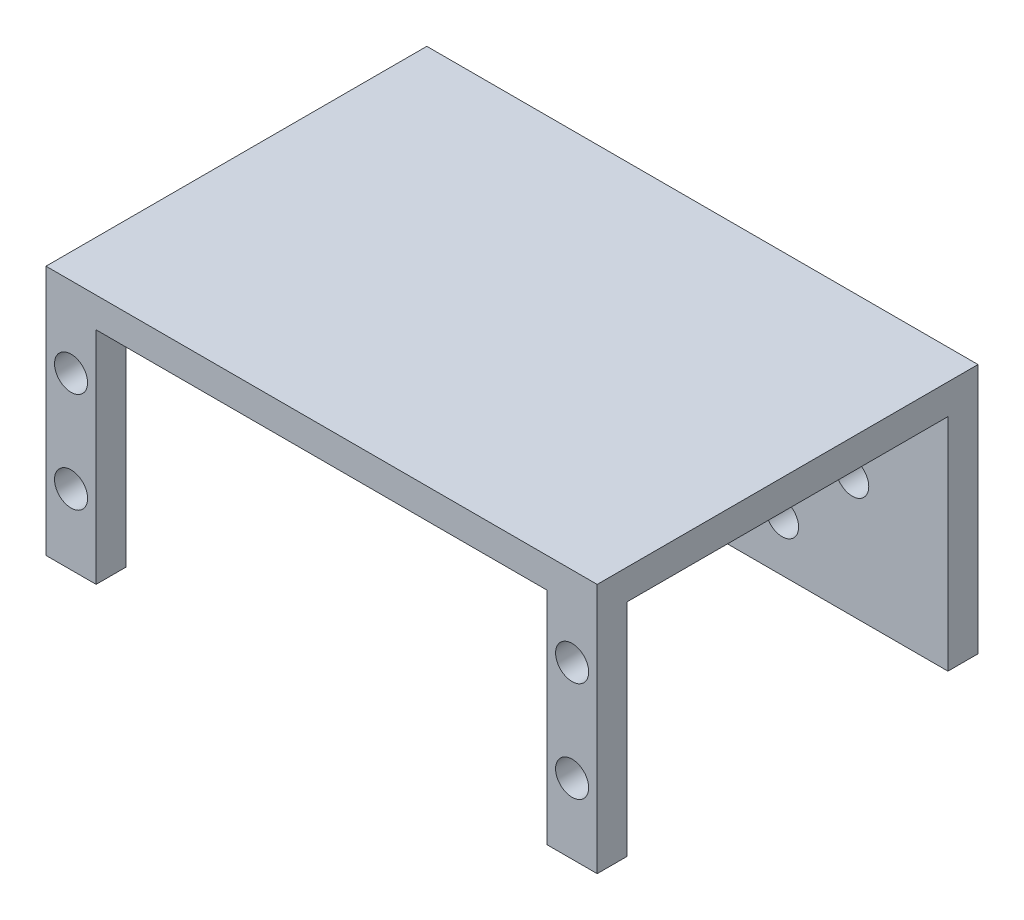
ISO-10303-21;
HEADER;
FILE_DESCRIPTION(('STEP AP214'),'2;1');
FILE_NAME('part.step','',(''),(''),'','','');
FILE_SCHEMA(('AUTOMOTIVE_DESIGN { 1 0 10303 214 1 1 1 1 }'));
ENDSEC;
DATA;
#1=APPLICATION_CONTEXT('core data for automotive mechanical design processes');
#2=APPLICATION_PROTOCOL_DEFINITION('international standard','automotive_design',2000,#1);
#3=PRODUCT_CONTEXT('',#1,'mechanical');
#4=PRODUCT('Part','Part','',(#3));
#5=PRODUCT_RELATED_PRODUCT_CATEGORY('part','',(#4));
#6=PRODUCT_DEFINITION_FORMATION('','',#4);
#7=PRODUCT_DEFINITION_CONTEXT('part definition',#1,'design');
#8=PRODUCT_DEFINITION('design','',#6,#7);
#9=PRODUCT_DEFINITION_SHAPE('','',#8);
#10=(LENGTH_UNIT() NAMED_UNIT(*) SI_UNIT(.MILLI.,.METRE.));
#11=(NAMED_UNIT(*) PLANE_ANGLE_UNIT() SI_UNIT($,.RADIAN.));
#12=(NAMED_UNIT(*) SI_UNIT($,.STERADIAN.) SOLID_ANGLE_UNIT());
#13=UNCERTAINTY_MEASURE_WITH_UNIT(LENGTH_MEASURE(1.E-05),#10,'distance_accuracy_value','');
#14=(GEOMETRIC_REPRESENTATION_CONTEXT(3) GLOBAL_UNCERTAINTY_ASSIGNED_CONTEXT((#13)) GLOBAL_UNIT_ASSIGNED_CONTEXT((#10,
#11,#12)) REPRESENTATION_CONTEXT('',''));
#15=CARTESIAN_POINT('',(0.,0.,0.));
#16=DIRECTION('',(0.,0.,1.));
#17=DIRECTION('',(1.,0.,0.));
#18=AXIS2_PLACEMENT_3D('',#15,#16,#17);
#19=CARTESIAN_POINT('',(-27.5,9.5,38.));
#20=DIRECTION('',(0.,1.,0.));
#21=DIRECTION('',(-1.,0.,0.));
#22=AXIS2_PLACEMENT_3D('',#19,#20,#21);
#23=PLANE('',#22);
#24=DIRECTION('',(0.,0.,-1.));
#25=VECTOR('',#24,1.);
#26=CARTESIAN_POINT('',(22.5,9.5,38.));
#27=LINE('',#26,#25);
#28=CARTESIAN_POINT('',(22.5,9.5,38.));
#29=VERTEX_POINT('',#28);
#30=CARTESIAN_POINT('',(22.5,9.5,35.));
#31=VERTEX_POINT('',#30);
#32=EDGE_CURVE('E164',#29,#31,#27,.T.);
#33=ORIENTED_EDGE('',*,*,#32,.F.);
#34=DIRECTION('',(1.,0.,0.));
#35=VECTOR('',#34,1.);
#36=CARTESIAN_POINT('',(-27.5,9.5,38.));
#37=LINE('',#36,#35);
#38=CARTESIAN_POINT('',(-22.5,9.5,38.));
#39=VERTEX_POINT('',#38);
#40=EDGE_CURVE('E145',#39,#29,#37,.T.);
#41=ORIENTED_EDGE('',*,*,#40,.F.);
#42=DIRECTION('',(0.,0.,1.));
#43=VECTOR('',#42,1.);
#44=CARTESIAN_POINT('',(-22.5,9.5,38.));
#45=LINE('',#44,#43);
#46=CARTESIAN_POINT('',(-22.5,9.5,35.));
#47=VERTEX_POINT('',#46);
#48=EDGE_CURVE('E191',#47,#39,#45,.T.);
#49=ORIENTED_EDGE('',*,*,#48,.F.);
#50=DIRECTION('',(1.,0.,0.));
#51=VECTOR('',#50,1.);
#52=CARTESIAN_POINT('',(-27.5,9.5,35.));
#53=LINE('',#52,#51);
#54=CARTESIAN_POINT('',(-27.5,9.5,35.));
#55=VERTEX_POINT('',#54);
#56=EDGE_CURVE('E185',#55,#47,#53,.T.);
#57=ORIENTED_EDGE('',*,*,#56,.F.);
#58=DIRECTION('',(0.,0.,-1.));
#59=VECTOR('',#58,1.);
#60=CARTESIAN_POINT('',(-27.5,9.5,38.));
#61=LINE('',#60,#59);
#62=CARTESIAN_POINT('',(-27.5,9.5,3.));
#63=VERTEX_POINT('',#62);
#64=EDGE_CURVE('E65',#55,#63,#61,.T.);
#65=ORIENTED_EDGE('',*,*,#64,.T.);
#66=DIRECTION('',(1.,0.,0.));
#67=VECTOR('',#66,1.);
#68=CARTESIAN_POINT('',(-27.5,9.5,3.));
#69=LINE('',#68,#67);
#70=CARTESIAN_POINT('',(27.5,9.5,3.));
#71=VERTEX_POINT('',#70);
#72=EDGE_CURVE('E214',#63,#71,#69,.T.);
#73=ORIENTED_EDGE('',*,*,#72,.T.);
#74=DIRECTION('',(0.,0.,-1.));
#75=VECTOR('',#74,1.);
#76=CARTESIAN_POINT('',(27.5,9.5,38.));
#77=LINE('',#76,#75);
#78=CARTESIAN_POINT('',(27.5,9.5,35.));
#79=VERTEX_POINT('',#78);
#80=EDGE_CURVE('E222',#79,#71,#77,.T.);
#81=ORIENTED_EDGE('',*,*,#80,.F.);
#82=DIRECTION('',(1.,0.,0.));
#83=VECTOR('',#82,1.);
#84=CARTESIAN_POINT('',(27.5,9.5,35.));
#85=LINE('',#84,#83);
#86=EDGE_CURVE('E161',#31,#79,#85,.T.);
#87=ORIENTED_EDGE('',*,*,#86,.F.);
#88=EDGE_LOOP('',(#33,#41,#49,#57,#65,#73,#81,#87));
#89=FACE_BOUND('',#88,.T.);
#90=ADVANCED_FACE('F39',(#89),#23,.F.);
#91=CARTESIAN_POINT('',(0.,0.,3.));
#92=DIRECTION('',(0.,0.,-1.));
#93=DIRECTION('',(-1.,0.,0.));
#94=AXIS2_PLACEMENT_3D('',#91,#92,#93);
#95=PLANE('',#94);
#96=CARTESIAN_POINT('',(17.95,-0.499999999999997,3.));
#97=DIRECTION('',(0.,0.,1.));
#98=DIRECTION('',(1.,0.,0.));
#99=AXIS2_PLACEMENT_3D('',#96,#97,#98);
#100=CIRCLE('',#99,1.65);
#101=CARTESIAN_POINT('',(19.6,-0.499999999999997,3.));
#102=VERTEX_POINT('',#101);
#103=EDGE_CURVE('E267',#102,#102,#100,.T.);
#104=ORIENTED_EDGE('',*,*,#103,.F.);
#105=EDGE_LOOP('',(#104));
#106=FACE_BOUND('',#105,.T.);
#107=CARTESIAN_POINT('',(10.95,6.5,3.));
#108=DIRECTION('',(0.,0.,1.));
#109=DIRECTION('',(1.,0.,0.));
#110=AXIS2_PLACEMENT_3D('',#107,#108,#109);
#111=CIRCLE('',#110,1.65);
#112=CARTESIAN_POINT('',(12.6,6.5,3.));
#113=VERTEX_POINT('',#112);
#114=EDGE_CURVE('E583',#113,#113,#111,.T.);
#115=ORIENTED_EDGE('',*,*,#114,.F.);
#116=EDGE_LOOP('',(#115));
#117=FACE_BOUND('',#116,.T.);
#118=CARTESIAN_POINT('',(3.94999999999999,-0.499999999999997,3.));
#119=DIRECTION('',(0.,0.,1.));
#120=DIRECTION('',(1.,0.,0.));
#121=AXIS2_PLACEMENT_3D('',#118,#119,#120);
#122=CIRCLE('',#121,1.65);
#123=CARTESIAN_POINT('',(5.59999999999999,-0.499999999999997,3.));
#124=VERTEX_POINT('',#123);
#125=EDGE_CURVE('E587',#124,#124,#122,.T.);
#126=ORIENTED_EDGE('',*,*,#125,.F.);
#127=EDGE_LOOP('',(#126));
#128=FACE_BOUND('',#127,.T.);
#129=CARTESIAN_POINT('',(10.95,-7.5,3.));
#130=DIRECTION('',(0.,0.,1.));
#131=DIRECTION('',(1.,0.,0.));
#132=AXIS2_PLACEMENT_3D('',#129,#130,#131);
#133=CIRCLE('',#132,1.65);
#134=CARTESIAN_POINT('',(12.6,-7.5,3.));
#135=VERTEX_POINT('',#134);
#136=EDGE_CURVE('E592',#135,#135,#133,.T.);
#137=ORIENTED_EDGE('',*,*,#136,.F.);
#138=EDGE_LOOP('',(#137));
#139=FACE_BOUND('',#138,.T.);
#140=ORIENTED_EDGE('',*,*,#72,.F.);
#141=DIRECTION('',(0.,-1.,0.));
#142=VECTOR('',#141,1.);
#143=CARTESIAN_POINT('',(-27.5,-12.5,3.));
#144=LINE('',#143,#142);
#145=CARTESIAN_POINT('',(-27.5,-12.5,3.));
#146=VERTEX_POINT('',#145);
#147=EDGE_CURVE('E234',#63,#146,#144,.T.);
#148=ORIENTED_EDGE('',*,*,#147,.T.);
#149=DIRECTION('',(1.,0.,0.));
#150=VECTOR('',#149,1.);
#151=CARTESIAN_POINT('',(-27.5,-12.5,3.));
#152=LINE('',#151,#150);
#153=CARTESIAN_POINT('',(27.5,-12.5,3.));
#154=VERTEX_POINT('',#153);
#155=EDGE_CURVE('E238',#146,#154,#152,.T.);
#156=ORIENTED_EDGE('',*,*,#155,.T.);
#157=DIRECTION('',(0.,1.,0.));
#158=VECTOR('',#157,1.);
#159=CARTESIAN_POINT('',(27.5,-12.5,3.));
#160=LINE('',#159,#158);
#161=EDGE_CURVE('E230',#154,#71,#160,.T.);
#162=ORIENTED_EDGE('',*,*,#161,.T.);
#163=EDGE_LOOP('',(#140,#148,#156,#162));
#164=FACE_BOUND('',#163,.T.);
#165=ADVANCED_FACE('F334',(#106,#117,#128,#139,#164),#95,.F.);
#166=CARTESIAN_POINT('',(27.5,-12.5,3.));
#167=DIRECTION('',(-1.,0.,0.));
#168=DIRECTION('',(0.,0.,1.));
#169=AXIS2_PLACEMENT_3D('',#166,#167,#168);
#170=PLANE('',#169);
#171=DIRECTION('',(0.,1.,0.));
#172=VECTOR('',#171,1.);
#173=CARTESIAN_POINT('',(27.5,-12.5,0.));
#174=LINE('',#173,#172);
#175=CARTESIAN_POINT('',(27.5,-12.5,0.));
#176=VERTEX_POINT('',#175);
#177=CARTESIAN_POINT('',(27.5,12.5,0.));
#178=VERTEX_POINT('',#177);
#179=EDGE_CURVE('E229',#176,#178,#174,.T.);
#180=ORIENTED_EDGE('',*,*,#179,.T.);
#181=DIRECTION('',(0.,0.,-1.));
#182=VECTOR('',#181,1.);
#183=CARTESIAN_POINT('',(27.5,12.5,3.));
#184=LINE('',#183,#182);
#185=CARTESIAN_POINT('',(27.5,12.5,38.));
#186=VERTEX_POINT('',#185);
#187=EDGE_CURVE('E11',#186,#178,#184,.T.);
#188=ORIENTED_EDGE('',*,*,#187,.F.);
#189=DIRECTION('',(0.,1.,0.));
#190=VECTOR('',#189,1.);
#191=CARTESIAN_POINT('',(27.5,12.5,38.));
#192=LINE('',#191,#190);
#193=CARTESIAN_POINT('',(27.5,-12.5,38.));
#194=VERTEX_POINT('',#193);
#195=EDGE_CURVE('E135',#194,#186,#192,.T.);
#196=ORIENTED_EDGE('',*,*,#195,.F.);
#197=DIRECTION('',(0.,0.,1.));
#198=VECTOR('',#197,1.);
#199=CARTESIAN_POINT('',(27.5,-12.5,38.));
#200=LINE('',#199,#198);
#201=CARTESIAN_POINT('',(27.5,-12.5,35.));
#202=VERTEX_POINT('',#201);
#203=EDGE_CURVE('E140',#202,#194,#200,.T.);
#204=ORIENTED_EDGE('',*,*,#203,.F.);
#205=DIRECTION('',(0.,1.,0.));
#206=VECTOR('',#205,1.);
#207=CARTESIAN_POINT('',(27.5,-12.5,35.));
#208=LINE('',#207,#206);
#209=EDGE_CURVE('E174',#202,#79,#208,.T.);
#210=ORIENTED_EDGE('',*,*,#209,.T.);
#211=ORIENTED_EDGE('',*,*,#80,.T.);
#212=ORIENTED_EDGE('',*,*,#161,.F.);
#213=DIRECTION('',(0.,0.,-1.));
#214=VECTOR('',#213,1.);
#215=CARTESIAN_POINT('',(27.5,-12.5,3.));
#216=LINE('',#215,#214);
#217=EDGE_CURVE('E241',#154,#176,#216,.T.);
#218=ORIENTED_EDGE('',*,*,#217,.T.);
#219=EDGE_LOOP('',(#180,#188,#196,#204,#210,#211,#212,#218));
#220=FACE_BOUND('',#219,.T.);
#221=ADVANCED_FACE('F41',(#220),#170,.F.);
#222=CARTESIAN_POINT('',(-27.5,12.5,3.));
#223=DIRECTION('',(0.,-1.,0.));
#224=DIRECTION('',(0.,0.,-1.));
#225=AXIS2_PLACEMENT_3D('',#222,#223,#224);
#226=PLANE('',#225);
#227=DIRECTION('',(-1.,0.,0.));
#228=VECTOR('',#227,1.);
#229=CARTESIAN_POINT('',(-27.5,12.5,0.));
#230=LINE('',#229,#228);
#231=CARTESIAN_POINT('',(-27.5,12.5,0.));
#232=VERTEX_POINT('',#231);
#233=EDGE_CURVE('E244',#178,#232,#230,.T.);
#234=ORIENTED_EDGE('',*,*,#233,.T.);
#235=DIRECTION('',(0.,0.,-1.));
#236=VECTOR('',#235,1.);
#237=CARTESIAN_POINT('',(-27.5,12.5,3.));
#238=LINE('',#237,#236);
#239=CARTESIAN_POINT('',(-27.5,12.5,38.));
#240=VERTEX_POINT('',#239);
#241=EDGE_CURVE('E49',#240,#232,#238,.T.);
#242=ORIENTED_EDGE('',*,*,#241,.F.);
#243=DIRECTION('',(-1.,0.,0.));
#244=VECTOR('',#243,1.);
#245=CARTESIAN_POINT('',(-27.5,12.5,38.));
#246=LINE('',#245,#244);
#247=EDGE_CURVE('E144',#186,#240,#246,.T.);
#248=ORIENTED_EDGE('',*,*,#247,.F.);
#249=ORIENTED_EDGE('',*,*,#187,.T.);
#250=EDGE_LOOP('',(#234,#242,#248,#249));
#251=FACE_BOUND('',#250,.T.);
#252=ADVANCED_FACE('F349',(#251),#226,.F.);
#253=CARTESIAN_POINT('',(-27.5,-12.5,3.));
#254=DIRECTION('',(1.,0.,0.));
#255=DIRECTION('',(0.,0.,-1.));
#256=AXIS2_PLACEMENT_3D('',#253,#254,#255);
#257=PLANE('',#256);
#258=DIRECTION('',(0.,-1.,0.));
#259=VECTOR('',#258,1.);
#260=CARTESIAN_POINT('',(-27.5,-12.5,0.));
#261=LINE('',#260,#259);
#262=CARTESIAN_POINT('',(-27.5,-12.5,0.));
#263=VERTEX_POINT('',#262);
#264=EDGE_CURVE('E247',#232,#263,#261,.T.);
#265=ORIENTED_EDGE('',*,*,#264,.T.);
#266=DIRECTION('',(0.,0.,-1.));
#267=VECTOR('',#266,1.);
#268=CARTESIAN_POINT('',(-27.5,-12.5,3.));
#269=LINE('',#268,#267);
#270=EDGE_CURVE('E255',#146,#263,#269,.T.);
#271=ORIENTED_EDGE('',*,*,#270,.F.);
#272=ORIENTED_EDGE('',*,*,#147,.F.);
#273=ORIENTED_EDGE('',*,*,#64,.F.);
#274=DIRECTION('',(0.,1.,0.));
#275=VECTOR('',#274,1.);
#276=CARTESIAN_POINT('',(-27.5,-12.5,35.));
#277=LINE('',#276,#275);
#278=CARTESIAN_POINT('',(-27.5,-12.5,35.));
#279=VERTEX_POINT('',#278);
#280=EDGE_CURVE('E211',#279,#55,#277,.T.);
#281=ORIENTED_EDGE('',*,*,#280,.F.);
#282=DIRECTION('',(0.,0.,-1.));
#283=VECTOR('',#282,1.);
#284=CARTESIAN_POINT('',(-27.5,-12.5,38.));
#285=LINE('',#284,#283);
#286=CARTESIAN_POINT('',(-27.5,-12.5,38.));
#287=VERTEX_POINT('',#286);
#288=EDGE_CURVE('E186',#287,#279,#285,.T.);
#289=ORIENTED_EDGE('',*,*,#288,.F.);
#290=DIRECTION('',(0.,-1.,0.));
#291=VECTOR('',#290,1.);
#292=CARTESIAN_POINT('',(-27.5,12.5,38.));
#293=LINE('',#292,#291);
#294=EDGE_CURVE('E215',#240,#287,#293,.T.);
#295=ORIENTED_EDGE('',*,*,#294,.F.);
#296=ORIENTED_EDGE('',*,*,#241,.T.);
#297=EDGE_LOOP('',(#265,#271,#272,#273,#281,#289,#295,#296));
#298=FACE_BOUND('',#297,.T.);
#299=ADVANCED_FACE('F337',(#298),#257,.F.);
#300=CARTESIAN_POINT('',(-27.5,-12.5,3.));
#301=DIRECTION('',(0.,1.,0.));
#302=DIRECTION('',(0.,0.,1.));
#303=AXIS2_PLACEMENT_3D('',#300,#301,#302);
#304=PLANE('',#303);
#305=DIRECTION('',(1.,0.,0.));
#306=VECTOR('',#305,1.);
#307=CARTESIAN_POINT('',(-27.5,-12.5,0.));
#308=LINE('',#307,#306);
#309=EDGE_CURVE('E235',#263,#176,#308,.T.);
#310=ORIENTED_EDGE('',*,*,#309,.T.);
#311=ORIENTED_EDGE('',*,*,#217,.F.);
#312=ORIENTED_EDGE('',*,*,#155,.F.);
#313=ORIENTED_EDGE('',*,*,#270,.T.);
#314=EDGE_LOOP('',(#310,#311,#312,#313));
#315=FACE_BOUND('',#314,.T.);
#316=ADVANCED_FACE('F344',(#315),#304,.F.);
#317=CARTESIAN_POINT('',(0.,0.,0.));
#318=DIRECTION('',(0.,0.,-1.));
#319=DIRECTION('',(-1.,0.,0.));
#320=AXIS2_PLACEMENT_3D('',#317,#318,#319);
#321=PLANE('',#320);
#322=CARTESIAN_POINT('',(17.95,-0.499999999999997,0.));
#323=DIRECTION('',(0.,0.,-1.));
#324=DIRECTION('',(-1.,0.,0.));
#325=AXIS2_PLACEMENT_3D('',#322,#323,#324);
#326=CIRCLE('',#325,1.65);
#327=CARTESIAN_POINT('',(16.3,-0.499999999999997,0.));
#328=VERTEX_POINT('',#327);
#329=EDGE_CURVE('E43',#328,#328,#326,.T.);
#330=ORIENTED_EDGE('',*,*,#329,.F.);
#331=EDGE_LOOP('',(#330));
#332=FACE_BOUND('',#331,.T.);
#333=CARTESIAN_POINT('',(10.95,6.5,0.));
#334=DIRECTION('',(0.,0.,-1.));
#335=DIRECTION('',(-1.,0.,0.));
#336=AXIS2_PLACEMENT_3D('',#333,#334,#335);
#337=CIRCLE('',#336,1.65);
#338=CARTESIAN_POINT('',(9.29999999999999,6.5,0.));
#339=VERTEX_POINT('',#338);
#340=EDGE_CURVE('E270',#339,#339,#337,.T.);
#341=ORIENTED_EDGE('',*,*,#340,.F.);
#342=EDGE_LOOP('',(#341));
#343=FACE_BOUND('',#342,.T.);
#344=CARTESIAN_POINT('',(3.94999999999999,-0.499999999999997,0.));
#345=DIRECTION('',(0.,0.,-1.));
#346=DIRECTION('',(-1.,0.,0.));
#347=AXIS2_PLACEMENT_3D('',#344,#345,#346);
#348=CIRCLE('',#347,1.65);
#349=CARTESIAN_POINT('',(2.29999999999999,-0.499999999999997,0.));
#350=VERTEX_POINT('',#349);
#351=EDGE_CURVE('E266',#350,#350,#348,.T.);
#352=ORIENTED_EDGE('',*,*,#351,.F.);
#353=EDGE_LOOP('',(#352));
#354=FACE_BOUND('',#353,.T.);
#355=CARTESIAN_POINT('',(10.95,-7.5,0.));
#356=DIRECTION('',(0.,0.,-1.));
#357=DIRECTION('',(-1.,0.,0.));
#358=AXIS2_PLACEMENT_3D('',#355,#356,#357);
#359=CIRCLE('',#358,1.65);
#360=CARTESIAN_POINT('',(9.29999999999999,-7.5,0.));
#361=VERTEX_POINT('',#360);
#362=EDGE_CURVE('E262',#361,#361,#359,.T.);
#363=ORIENTED_EDGE('',*,*,#362,.F.);
#364=EDGE_LOOP('',(#363));
#365=FACE_BOUND('',#364,.T.);
#366=ORIENTED_EDGE('',*,*,#179,.F.);
#367=ORIENTED_EDGE('',*,*,#309,.F.);
#368=ORIENTED_EDGE('',*,*,#264,.F.);
#369=ORIENTED_EDGE('',*,*,#233,.F.);
#370=EDGE_LOOP('',(#366,#367,#368,#369));
#371=FACE_BOUND('',#370,.T.);
#372=ADVANCED_FACE('F347',(#332,#343,#354,#365,#371),#321,.T.);
#373=CARTESIAN_POINT('',(0.,0.,38.));
#374=DIRECTION('',(0.,0.,1.));
#375=DIRECTION('',(1.,0.,0.));
#376=AXIS2_PLACEMENT_3D('',#373,#374,#375);
#377=PLANE('',#376);
#378=CARTESIAN_POINT('',(25.,-5.5,38.));
#379=DIRECTION('',(0.,0.,1.));
#380=DIRECTION('',(-1.,0.,0.));
#381=AXIS2_PLACEMENT_3D('',#378,#379,#380);
#382=CIRCLE('',#381,1.65);
#383=CARTESIAN_POINT('',(23.35,-5.5,38.));
#384=VERTEX_POINT('',#383);
#385=EDGE_CURVE('E277',#384,#384,#382,.T.);
#386=ORIENTED_EDGE('',*,*,#385,.F.);
#387=EDGE_LOOP('',(#386));
#388=FACE_BOUND('',#387,.T.);
#389=CARTESIAN_POINT('',(25.,4.5,38.));
#390=DIRECTION('',(0.,0.,1.));
#391=DIRECTION('',(-1.,0.,0.));
#392=AXIS2_PLACEMENT_3D('',#389,#390,#391);
#393=CIRCLE('',#392,1.65);
#394=CARTESIAN_POINT('',(23.35,4.5,38.));
#395=VERTEX_POINT('',#394);
#396=EDGE_CURVE('E288',#395,#395,#393,.T.);
#397=ORIENTED_EDGE('',*,*,#396,.F.);
#398=EDGE_LOOP('',(#397));
#399=FACE_BOUND('',#398,.T.);
#400=CARTESIAN_POINT('',(-25.,4.5,38.));
#401=DIRECTION('',(0.,0.,1.));
#402=DIRECTION('',(1.,0.,0.));
#403=AXIS2_PLACEMENT_3D('',#400,#401,#402);
#404=CIRCLE('',#403,1.65);
#405=CARTESIAN_POINT('',(-23.35,4.5,38.));
#406=VERTEX_POINT('',#405);
#407=EDGE_CURVE('E303',#406,#406,#404,.T.);
#408=ORIENTED_EDGE('',*,*,#407,.F.);
#409=EDGE_LOOP('',(#408));
#410=FACE_BOUND('',#409,.T.);
#411=CARTESIAN_POINT('',(-25.,-5.5,38.));
#412=DIRECTION('',(0.,0.,1.));
#413=DIRECTION('',(1.,0.,0.));
#414=AXIS2_PLACEMENT_3D('',#411,#412,#413);
#415=CIRCLE('',#414,1.65);
#416=CARTESIAN_POINT('',(-23.35,-5.5,38.));
#417=VERTEX_POINT('',#416);
#418=EDGE_CURVE('E293',#417,#417,#415,.T.);
#419=ORIENTED_EDGE('',*,*,#418,.F.);
#420=EDGE_LOOP('',(#419));
#421=FACE_BOUND('',#420,.T.);
#422=ORIENTED_EDGE('',*,*,#294,.T.);
#423=DIRECTION('',(-1.,0.,0.));
#424=VECTOR('',#423,1.);
#425=CARTESIAN_POINT('',(-27.5,-12.5,38.));
#426=LINE('',#425,#424);
#427=CARTESIAN_POINT('',(-22.5,-12.5,38.));
#428=VERTEX_POINT('',#427);
#429=EDGE_CURVE('E197',#428,#287,#426,.T.);
#430=ORIENTED_EDGE('',*,*,#429,.F.);
#431=DIRECTION('',(0.,1.,0.));
#432=VECTOR('',#431,1.);
#433=CARTESIAN_POINT('',(-22.5,-12.5,38.));
#434=LINE('',#433,#432);
#435=EDGE_CURVE('E57',#428,#39,#434,.T.);
#436=ORIENTED_EDGE('',*,*,#435,.T.);
#437=ORIENTED_EDGE('',*,*,#40,.T.);
#438=DIRECTION('',(0.,1.,0.));
#439=VECTOR('',#438,1.);
#440=CARTESIAN_POINT('',(22.5,-12.5,38.));
#441=LINE('',#440,#439);
#442=CARTESIAN_POINT('',(22.5,-12.5,38.));
#443=VERTEX_POINT('',#442);
#444=EDGE_CURVE('E150',#443,#29,#441,.T.);
#445=ORIENTED_EDGE('',*,*,#444,.F.);
#446=DIRECTION('',(-1.,0.,0.));
#447=VECTOR('',#446,1.);
#448=CARTESIAN_POINT('',(27.5,-12.5,38.));
#449=LINE('',#448,#447);
#450=EDGE_CURVE('E148',#194,#443,#449,.T.);
#451=ORIENTED_EDGE('',*,*,#450,.F.);
#452=ORIENTED_EDGE('',*,*,#195,.T.);
#453=ORIENTED_EDGE('',*,*,#247,.T.);
#454=EDGE_LOOP('',(#422,#430,#436,#437,#445,#451,#452,#453));
#455=FACE_BOUND('',#454,.T.);
#456=ADVANCED_FACE('F149',(#388,#399,#410,#421,#455),#377,.T.);
#457=CARTESIAN_POINT('',(-27.5,-12.5,35.));
#458=DIRECTION('',(0.,0.,1.));
#459=DIRECTION('',(1.,0.,0.));
#460=AXIS2_PLACEMENT_3D('',#457,#458,#459);
#461=PLANE('',#460);
#462=CARTESIAN_POINT('',(-25.,4.5,35.));
#463=DIRECTION('',(0.,0.,1.));
#464=DIRECTION('',(1.,0.,0.));
#465=AXIS2_PLACEMENT_3D('',#462,#463,#464);
#466=CIRCLE('',#465,1.65);
#467=CARTESIAN_POINT('',(-23.35,4.5,35.));
#468=VERTEX_POINT('',#467);
#469=EDGE_CURVE('E296',#468,#468,#466,.F.);
#470=ORIENTED_EDGE('',*,*,#469,.F.);
#471=EDGE_LOOP('',(#470));
#472=FACE_BOUND('',#471,.T.);
#473=CARTESIAN_POINT('',(-25.,-5.5,35.));
#474=DIRECTION('',(0.,0.,1.));
#475=DIRECTION('',(1.,0.,0.));
#476=AXIS2_PLACEMENT_3D('',#473,#474,#475);
#477=CIRCLE('',#476,1.65);
#478=CARTESIAN_POINT('',(-23.35,-5.5,35.));
#479=VERTEX_POINT('',#478);
#480=EDGE_CURVE('E167',#479,#479,#477,.F.);
#481=ORIENTED_EDGE('',*,*,#480,.F.);
#482=EDGE_LOOP('',(#481));
#483=FACE_BOUND('',#482,.T.);
#484=ORIENTED_EDGE('',*,*,#56,.T.);
#485=DIRECTION('',(0.,1.,0.));
#486=VECTOR('',#485,1.);
#487=CARTESIAN_POINT('',(-22.5,-12.5,35.));
#488=LINE('',#487,#486);
#489=CARTESIAN_POINT('',(-22.5,-12.5,35.));
#490=VERTEX_POINT('',#489);
#491=EDGE_CURVE('E207',#490,#47,#488,.T.);
#492=ORIENTED_EDGE('',*,*,#491,.F.);
#493=DIRECTION('',(1.,0.,0.));
#494=VECTOR('',#493,1.);
#495=CARTESIAN_POINT('',(-27.5,-12.5,35.));
#496=LINE('',#495,#494);
#497=EDGE_CURVE('E190',#279,#490,#496,.T.);
#498=ORIENTED_EDGE('',*,*,#497,.F.);
#499=ORIENTED_EDGE('',*,*,#280,.T.);
#500=EDGE_LOOP('',(#484,#492,#498,#499));
#501=FACE_BOUND('',#500,.T.);
#502=ADVANCED_FACE('F513',(#472,#483,#501),#461,.F.);
#503=CARTESIAN_POINT('',(-22.5,-12.5,38.));
#504=DIRECTION('',(-1.,0.,0.));
#505=DIRECTION('',(0.,-1.,0.));
#506=AXIS2_PLACEMENT_3D('',#503,#504,#505);
#507=PLANE('',#506);
#508=ORIENTED_EDGE('',*,*,#48,.T.);
#509=ORIENTED_EDGE('',*,*,#435,.F.);
#510=DIRECTION('',(0.,0.,1.));
#511=VECTOR('',#510,1.);
#512=CARTESIAN_POINT('',(-22.5,-12.5,38.));
#513=LINE('',#512,#511);
#514=EDGE_CURVE('E194',#490,#428,#513,.T.);
#515=ORIENTED_EDGE('',*,*,#514,.F.);
#516=ORIENTED_EDGE('',*,*,#491,.T.);
#517=EDGE_LOOP('',(#508,#509,#515,#516));
#518=FACE_BOUND('',#517,.T.);
#519=ADVANCED_FACE('F357',(#518),#507,.F.);
#520=CARTESIAN_POINT('',(0.,-12.5,0.));
#521=DIRECTION('',(0.,-1.,0.));
#522=DIRECTION('',(1.,0.,0.));
#523=AXIS2_PLACEMENT_3D('',#520,#521,#522);
#524=PLANE('',#523);
#525=ORIENTED_EDGE('',*,*,#288,.T.);
#526=ORIENTED_EDGE('',*,*,#497,.T.);
#527=ORIENTED_EDGE('',*,*,#514,.T.);
#528=ORIENTED_EDGE('',*,*,#429,.T.);
#529=EDGE_LOOP('',(#525,#526,#527,#528));
#530=FACE_BOUND('',#529,.T.);
#531=ADVANCED_FACE('F353',(#530),#524,.T.);
#532=CARTESIAN_POINT('',(22.5,-12.5,38.));
#533=DIRECTION('',(1.,0.,0.));
#534=DIRECTION('',(0.,1.,0.));
#535=AXIS2_PLACEMENT_3D('',#532,#533,#534);
#536=PLANE('',#535);
#537=ORIENTED_EDGE('',*,*,#32,.T.);
#538=DIRECTION('',(0.,1.,0.));
#539=VECTOR('',#538,1.);
#540=CARTESIAN_POINT('',(22.5,-12.5,35.));
#541=LINE('',#540,#539);
#542=CARTESIAN_POINT('',(22.5,-12.5,35.));
#543=VERTEX_POINT('',#542);
#544=EDGE_CURVE('E179',#543,#31,#541,.T.);
#545=ORIENTED_EDGE('',*,*,#544,.F.);
#546=DIRECTION('',(0.,0.,-1.));
#547=VECTOR('',#546,1.);
#548=CARTESIAN_POINT('',(22.5,-12.5,38.));
#549=LINE('',#548,#547);
#550=EDGE_CURVE('E154',#443,#543,#549,.T.);
#551=ORIENTED_EDGE('',*,*,#550,.F.);
#552=ORIENTED_EDGE('',*,*,#444,.T.);
#553=EDGE_LOOP('',(#537,#545,#551,#552));
#554=FACE_BOUND('',#553,.T.);
#555=ADVANCED_FACE('F324',(#554),#536,.F.);
#556=CARTESIAN_POINT('',(27.5,-12.5,35.));
#557=DIRECTION('',(0.,0.,1.));
#558=DIRECTION('',(1.,0.,0.));
#559=AXIS2_PLACEMENT_3D('',#556,#557,#558);
#560=PLANE('',#559);
#561=CARTESIAN_POINT('',(25.,-5.5,35.));
#562=DIRECTION('',(0.,0.,1.));
#563=DIRECTION('',(1.,0.,0.));
#564=AXIS2_PLACEMENT_3D('',#561,#562,#563);
#565=CIRCLE('',#564,1.65);
#566=CARTESIAN_POINT('',(26.65,-5.5,35.));
#567=VERTEX_POINT('',#566);
#568=EDGE_CURVE('E282',#567,#567,#565,.F.);
#569=ORIENTED_EDGE('',*,*,#568,.F.);
#570=EDGE_LOOP('',(#569));
#571=FACE_BOUND('',#570,.T.);
#572=CARTESIAN_POINT('',(25.,4.5,35.));
#573=DIRECTION('',(0.,0.,1.));
#574=DIRECTION('',(1.,0.,0.));
#575=AXIS2_PLACEMENT_3D('',#572,#573,#574);
#576=CIRCLE('',#575,1.65);
#577=CARTESIAN_POINT('',(26.65,4.5,35.));
#578=VERTEX_POINT('',#577);
#579=EDGE_CURVE('E291',#578,#578,#576,.F.);
#580=ORIENTED_EDGE('',*,*,#579,.F.);
#581=EDGE_LOOP('',(#580));
#582=FACE_BOUND('',#581,.T.);
#583=ORIENTED_EDGE('',*,*,#86,.T.);
#584=ORIENTED_EDGE('',*,*,#209,.F.);
#585=DIRECTION('',(1.,0.,0.));
#586=VECTOR('',#585,1.);
#587=CARTESIAN_POINT('',(27.5,-12.5,35.));
#588=LINE('',#587,#586);
#589=EDGE_CURVE('E158',#543,#202,#588,.T.);
#590=ORIENTED_EDGE('',*,*,#589,.F.);
#591=ORIENTED_EDGE('',*,*,#544,.T.);
#592=EDGE_LOOP('',(#583,#584,#590,#591));
#593=FACE_BOUND('',#592,.T.);
#594=ADVANCED_FACE('F321',(#571,#582,#593),#560,.F.);
#595=CARTESIAN_POINT('',(0.,-12.5,0.));
#596=DIRECTION('',(0.,1.,0.));
#597=DIRECTION('',(-1.,0.,0.));
#598=AXIS2_PLACEMENT_3D('',#595,#596,#597);
#599=PLANE('',#598);
#600=ORIENTED_EDGE('',*,*,#203,.T.);
#601=ORIENTED_EDGE('',*,*,#450,.T.);
#602=ORIENTED_EDGE('',*,*,#550,.T.);
#603=ORIENTED_EDGE('',*,*,#589,.T.);
#604=EDGE_LOOP('',(#600,#601,#602,#603));
#605=FACE_BOUND('',#604,.T.);
#606=ADVANCED_FACE('F156',(#605),#599,.F.);
#607=CARTESIAN_POINT('',(25.,4.5,-0.001000000000001));
#608=DIRECTION('',(0.,0.,1.));
#609=DIRECTION('',(1.,0.,0.));
#610=AXIS2_PLACEMENT_3D('',#607,#608,#609);
#611=CYLINDRICAL_SURFACE('',#610,1.65);
#612=ORIENTED_EDGE('',*,*,#396,.T.);
#613=EDGE_LOOP('',(#612));
#614=FACE_BOUND('',#613,.T.);
#615=ORIENTED_EDGE('',*,*,#579,.T.);
#616=EDGE_LOOP('',(#615));
#617=FACE_BOUND('',#616,.T.);
#618=ADVANCED_FACE('F319',(#614,#617),#611,.F.);
#619=CARTESIAN_POINT('',(25.,-5.5,-0.001000000000001));
#620=DIRECTION('',(0.,0.,1.));
#621=DIRECTION('',(1.,0.,0.));
#622=AXIS2_PLACEMENT_3D('',#619,#620,#621);
#623=CYLINDRICAL_SURFACE('',#622,1.65);
#624=ORIENTED_EDGE('',*,*,#385,.T.);
#625=EDGE_LOOP('',(#624));
#626=FACE_BOUND('',#625,.T.);
#627=ORIENTED_EDGE('',*,*,#568,.T.);
#628=EDGE_LOOP('',(#627));
#629=FACE_BOUND('',#628,.T.);
#630=ADVANCED_FACE('F458',(#626,#629),#623,.F.);
#631=CARTESIAN_POINT('',(-25.,-5.5,-0.001000000000001));
#632=DIRECTION('',(0.,0.,1.));
#633=DIRECTION('',(1.,0.,0.));
#634=AXIS2_PLACEMENT_3D('',#631,#632,#633);
#635=CYLINDRICAL_SURFACE('',#634,1.65);
#636=ORIENTED_EDGE('',*,*,#418,.T.);
#637=EDGE_LOOP('',(#636));
#638=FACE_BOUND('',#637,.T.);
#639=ORIENTED_EDGE('',*,*,#480,.T.);
#640=EDGE_LOOP('',(#639));
#641=FACE_BOUND('',#640,.T.);
#642=ADVANCED_FACE('F454',(#638,#641),#635,.F.);
#643=CARTESIAN_POINT('',(-25.,4.5,-0.001000000000001));
#644=DIRECTION('',(0.,0.,1.));
#645=DIRECTION('',(1.,0.,0.));
#646=AXIS2_PLACEMENT_3D('',#643,#644,#645);
#647=CYLINDRICAL_SURFACE('',#646,1.65);
#648=ORIENTED_EDGE('',*,*,#407,.T.);
#649=EDGE_LOOP('',(#648));
#650=FACE_BOUND('',#649,.T.);
#651=ORIENTED_EDGE('',*,*,#469,.T.);
#652=EDGE_LOOP('',(#651));
#653=FACE_BOUND('',#652,.T.);
#654=ADVANCED_FACE('F402',(#650,#653),#647,.F.);
#655=CARTESIAN_POINT('',(10.95,-7.5,-17.));
#656=DIRECTION('',(0.,0.,1.));
#657=DIRECTION('',(1.,0.,0.));
#658=AXIS2_PLACEMENT_3D('',#655,#656,#657);
#659=CYLINDRICAL_SURFACE('',#658,1.65);
#660=ORIENTED_EDGE('',*,*,#362,.T.);
#661=EDGE_LOOP('',(#660));
#662=FACE_BOUND('',#661,.T.);
#663=ORIENTED_EDGE('',*,*,#136,.T.);
#664=EDGE_LOOP('',(#663));
#665=FACE_BOUND('',#664,.T.);
#666=ADVANCED_FACE('F414',(#662,#665),#659,.F.);
#667=CARTESIAN_POINT('',(3.94999999999999,-0.499999999999997,-17.));
#668=DIRECTION('',(0.,0.,1.));
#669=DIRECTION('',(1.,0.,0.));
#670=AXIS2_PLACEMENT_3D('',#667,#668,#669);
#671=CYLINDRICAL_SURFACE('',#670,1.65);
#672=ORIENTED_EDGE('',*,*,#351,.T.);
#673=EDGE_LOOP('',(#672));
#674=FACE_BOUND('',#673,.T.);
#675=ORIENTED_EDGE('',*,*,#125,.T.);
#676=EDGE_LOOP('',(#675));
#677=FACE_BOUND('',#676,.T.);
#678=ADVANCED_FACE('F419',(#674,#677),#671,.F.);
#679=CARTESIAN_POINT('',(10.95,6.5,-17.));
#680=DIRECTION('',(0.,0.,1.));
#681=DIRECTION('',(1.,0.,0.));
#682=AXIS2_PLACEMENT_3D('',#679,#680,#681);
#683=CYLINDRICAL_SURFACE('',#682,1.65);
#684=ORIENTED_EDGE('',*,*,#340,.T.);
#685=EDGE_LOOP('',(#684));
#686=FACE_BOUND('',#685,.T.);
#687=ORIENTED_EDGE('',*,*,#114,.T.);
#688=EDGE_LOOP('',(#687));
#689=FACE_BOUND('',#688,.T.);
#690=ADVANCED_FACE('F429',(#686,#689),#683,.F.);
#691=CARTESIAN_POINT('',(17.95,-0.499999999999997,-17.));
#692=DIRECTION('',(0.,0.,1.));
#693=DIRECTION('',(1.,0.,0.));
#694=AXIS2_PLACEMENT_3D('',#691,#692,#693);
#695=CYLINDRICAL_SURFACE('',#694,1.65);
#696=ORIENTED_EDGE('',*,*,#329,.T.);
#697=EDGE_LOOP('',(#696));
#698=FACE_BOUND('',#697,.T.);
#699=ORIENTED_EDGE('',*,*,#103,.T.);
#700=EDGE_LOOP('',(#699));
#701=FACE_BOUND('',#700,.T.);
#702=ADVANCED_FACE('F439',(#698,#701),#695,.F.);
#703=CLOSED_SHELL('',(#90,#165,#221,#252,#299,#316,#372,#456,#502,#519,#531,#555,#594,#606,#618,
#630,#642,#654,#666,#678,#690,#702));
#704=MANIFOLD_SOLID_BREP('B2',#703);
#705=ADVANCED_BREP_SHAPE_REPRESENTATION('',(#18,#704),#14);
#706=SHAPE_DEFINITION_REPRESENTATION(#9,#705);
ENDSEC;
END-ISO-10303-21;
